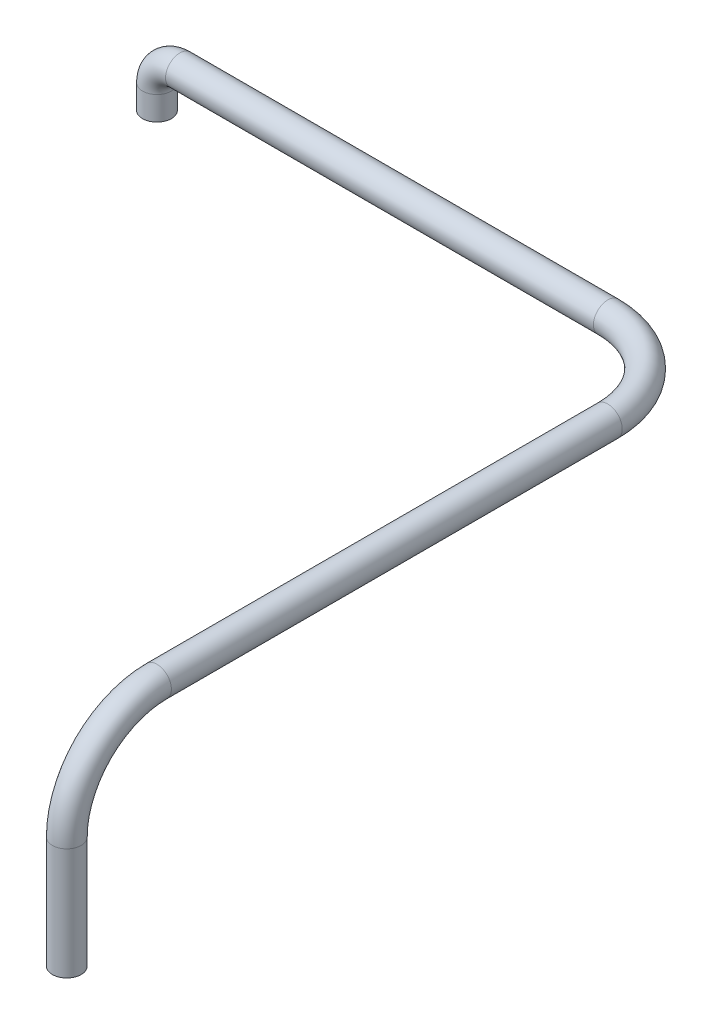
ISO-10303-21;
HEADER;
FILE_DESCRIPTION(('STEP AP214'),'2;1');
FILE_NAME('part.step','',(''),(''),'','','');
FILE_SCHEMA(('AUTOMOTIVE_DESIGN { 1 0 10303 214 1 1 1 1 }'));
ENDSEC;
DATA;
#1=APPLICATION_CONTEXT('core data for automotive mechanical design processes');
#2=APPLICATION_PROTOCOL_DEFINITION('international standard','automotive_design',2000,#1);
#3=PRODUCT_CONTEXT('',#1,'mechanical');
#4=PRODUCT('Part','Part','',(#3));
#5=PRODUCT_RELATED_PRODUCT_CATEGORY('part','',(#4));
#6=PRODUCT_DEFINITION_FORMATION('','',#4);
#7=PRODUCT_DEFINITION_CONTEXT('part definition',#1,'design');
#8=PRODUCT_DEFINITION('design','',#6,#7);
#9=PRODUCT_DEFINITION_SHAPE('','',#8);
#10=(LENGTH_UNIT() NAMED_UNIT(*) SI_UNIT(.MILLI.,.METRE.));
#11=(NAMED_UNIT(*) PLANE_ANGLE_UNIT() SI_UNIT($,.RADIAN.));
#12=(NAMED_UNIT(*) SI_UNIT($,.STERADIAN.) SOLID_ANGLE_UNIT());
#13=UNCERTAINTY_MEASURE_WITH_UNIT(LENGTH_MEASURE(1.E-05),#10,'distance_accuracy_value','');
#14=(GEOMETRIC_REPRESENTATION_CONTEXT(3) GLOBAL_UNCERTAINTY_ASSIGNED_CONTEXT((#13)) GLOBAL_UNIT_ASSIGNED_CONTEXT((#10,
#11,#12)) REPRESENTATION_CONTEXT('',''));
#15=CARTESIAN_POINT('',(0.,0.,0.));
#16=DIRECTION('',(0.,0.,1.));
#17=DIRECTION('',(1.,0.,0.));
#18=AXIS2_PLACEMENT_3D('',#15,#16,#17);
#19=CARTESIAN_POINT('',(-150.,43.,-175.));
#20=DIRECTION('',(0.,1.,0.));
#21=DIRECTION('',(0.,0.,1.));
#22=AXIS2_PLACEMENT_3D('',#19,#20,#21);
#23=PLANE('',#22);
#24=CARTESIAN_POINT('',(-150.,43.,-175.));
#25=DIRECTION('',(0.,1.,0.));
#26=DIRECTION('',(0.,0.,1.));
#27=AXIS2_PLACEMENT_3D('',#24,#25,#26);
#28=CIRCLE('',#27,3.);
#29=CARTESIAN_POINT('',(-150.,43.,-172.));
#30=VERTEX_POINT('',#29);
#31=EDGE_CURVE('E286',#30,#30,#28,.T.);
#32=ORIENTED_EDGE('',*,*,#31,.T.);
#33=EDGE_LOOP('',(#32));
#34=FACE_BOUND('',#33,.T.);
#35=CARTESIAN_POINT('',(-150.,43.,-175.));
#36=DIRECTION('',(0.,1.,0.));
#37=DIRECTION('',(0.,0.,1.));
#38=AXIS2_PLACEMENT_3D('',#35,#36,#37);
#39=CIRCLE('',#38,4.);
#40=CARTESIAN_POINT('',(-150.,43.,-171.));
#41=VERTEX_POINT('',#40);
#42=EDGE_CURVE('E70',#41,#41,#39,.T.);
#43=ORIENTED_EDGE('',*,*,#42,.F.);
#44=EDGE_LOOP('',(#43));
#45=FACE_BOUND('',#44,.T.);
#46=ADVANCED_FACE('F67',(#34,#45),#23,.F.);
#47=CARTESIAN_POINT('',(0.,0.,0.));
#48=DIRECTION('',(0.,-1.,0.));
#49=DIRECTION('',(-1.,0.,0.));
#50=AXIS2_PLACEMENT_3D('',#47,#48,#49);
#51=PLANE('',#50);
#52=CARTESIAN_POINT('',(0.,0.,0.));
#53=DIRECTION('',(0.,-1.,0.));
#54=DIRECTION('',(0.,0.,-1.));
#55=AXIS2_PLACEMENT_3D('',#52,#53,#54);
#56=CIRCLE('',#55,3.);
#57=CARTESIAN_POINT('',(0.,0.,3.00000000000006));
#58=VERTEX_POINT('',#57);
#59=EDGE_CURVE('E297',#58,#58,#56,.T.);
#60=ORIENTED_EDGE('',*,*,#59,.F.);
#61=EDGE_LOOP('',(#60));
#62=FACE_BOUND('',#61,.T.);
#63=CARTESIAN_POINT('',(0.,0.,0.));
#64=DIRECTION('',(0.,-1.,0.));
#65=DIRECTION('',(-1.,0.,0.));
#66=AXIS2_PLACEMENT_3D('',#63,#64,#65);
#67=CIRCLE('',#66,4.);
#68=CARTESIAN_POINT('',(0.,0.,4.00000000000006));
#69=VERTEX_POINT('',#68);
#70=EDGE_CURVE('E84',#69,#69,#67,.T.);
#71=ORIENTED_EDGE('',*,*,#70,.T.);
#72=EDGE_LOOP('',(#71));
#73=FACE_BOUND('',#72,.T.);
#74=ADVANCED_FACE('F108',(#62,#73),#51,.T.);
#75=CARTESIAN_POINT('',(-150.,49.63,-175.));
#76=DIRECTION('',(0.,-1.,0.));
#77=DIRECTION('',(0.,0.,-1.));
#78=AXIS2_PLACEMENT_3D('',#75,#76,#77);
#79=CYLINDRICAL_SURFACE('',#78,4.);
#80=ORIENTED_EDGE('',*,*,#42,.T.);
#81=EDGE_LOOP('',(#80));
#82=FACE_BOUND('',#81,.T.);
#83=CARTESIAN_POINT('',(-150.,49.63,-175.));
#84=DIRECTION('',(1.05137569081173E-07,0.999999999999994,0.));
#85=DIRECTION('',(0.,0.,1.));
#86=AXIS2_PLACEMENT_3D('',#83,#84,#85);
#87=CIRCLE('',#86,4.);
#88=CARTESIAN_POINT('',(-154.,49.6300004205503,-175.));
#89=VERTEX_POINT('',#88);
#90=EDGE_CURVE('E95',#89,#89,#87,.T.);
#91=ORIENTED_EDGE('',*,*,#90,.F.);
#92=EDGE_LOOP('',(#91));
#93=FACE_BOUND('',#92,.T.);
#94=ADVANCED_FACE('F106',(#82,#93),#79,.T.);
#95=CARTESIAN_POINT('',(-25.,56.,-175.));
#96=DIRECTION('',(-1.,0.,0.));
#97=DIRECTION('',(0.,0.,1.));
#98=AXIS2_PLACEMENT_3D('',#95,#96,#97);
#99=CYLINDRICAL_SURFACE('',#98,4.);
#100=CARTESIAN_POINT('',(-143.629999330274,56.,-175.));
#101=DIRECTION('',(1.,0.,0.));
#102=DIRECTION('',(0.,0.,1.));
#103=AXIS2_PLACEMENT_3D('',#100,#101,#102);
#104=CIRCLE('',#103,4.);
#105=CARTESIAN_POINT('',(-143.629999330274,60.0000000000001,-175.));
#106=VERTEX_POINT('',#105);
#107=EDGE_CURVE('E92',#106,#106,#104,.T.);
#108=ORIENTED_EDGE('',*,*,#107,.T.);
#109=EDGE_LOOP('',(#108));
#110=FACE_BOUND('',#109,.T.);
#111=CARTESIAN_POINT('',(-25.,56.,-175.));
#112=DIRECTION('',(0.999999999999998,0.,-6.42331466807782E-08));
#113=DIRECTION('',(6.42331466807782E-08,0.,0.999999999999998));
#114=AXIS2_PLACEMENT_3D('',#111,#112,#113);
#115=CIRCLE('',#114,4.);
#116=CARTESIAN_POINT('',(-25.0000002569326,56.,-179.));
#117=VERTEX_POINT('',#116);
#118=EDGE_CURVE('E93',#117,#117,#115,.T.);
#119=ORIENTED_EDGE('',*,*,#118,.F.);
#120=EDGE_LOOP('',(#119));
#121=FACE_BOUND('',#120,.T.);
#122=ADVANCED_FACE('F107',(#110,#121),#99,.T.);
#123=CARTESIAN_POINT('',(-143.629999330274,49.6299993302736,-175.));
#124=DIRECTION('',(0.,0.,1.));
#125=DIRECTION('',(1.,0.,0.));
#126=AXIS2_PLACEMENT_3D('',#123,#124,#125);
#127=TOROIDAL_SURFACE('',#126,6.37000066972643,4.);
#128=CARTESIAN_POINT('',(-143.629999330274,49.6299993302736,-175.));
#129=DIRECTION('',(0.,0.,1.));
#130=DIRECTION('',(1.,0.,0.));
#131=AXIS2_PLACEMENT_3D('',#128,#129,#130);
#132=CIRCLE('',#131,10.3700006697264);
#133=EDGE_CURVE('',#106,#89,#132,.T.);
#134=ORIENTED_EDGE('',*,*,#107,.F.);
#135=ORIENTED_EDGE('',*,*,#90,.T.);
#136=ORIENTED_EDGE('',*,*,#133,.T.);
#137=ORIENTED_EDGE('',*,*,#133,.F.);
#138=EDGE_LOOP('',(#134,#136,#135,#137));
#139=FACE_BOUND('',#138,.T.);
#140=ADVANCED_FACE('F103',(#139),#127,.T.);
#141=CARTESIAN_POINT('',(0.,56.,-25.));
#142=DIRECTION('',(0.,0.,-1.));
#143=DIRECTION('',(-1.,0.,0.));
#144=AXIS2_PLACEMENT_3D('',#141,#142,#143);
#145=CYLINDRICAL_SURFACE('',#144,4.);
#146=CARTESIAN_POINT('',(0.,56.,-150.000001605829));
#147=DIRECTION('',(0.,0.,1.));
#148=DIRECTION('',(-1.,0.,0.));
#149=AXIS2_PLACEMENT_3D('',#146,#147,#148);
#150=CIRCLE('',#149,4.);
#151=CARTESIAN_POINT('',(4.00000000000006,56.,-150.000001605829));
#152=VERTEX_POINT('',#151);
#153=EDGE_CURVE('E87',#152,#152,#150,.T.);
#154=ORIENTED_EDGE('',*,*,#153,.T.);
#155=EDGE_LOOP('',(#154));
#156=FACE_BOUND('',#155,.T.);
#157=CARTESIAN_POINT('',(0.,56.,-25.0000000000001));
#158=DIRECTION('',(0.,6.42331450154434E-08,0.999999999999998));
#159=DIRECTION('',(-1.,0.,0.));
#160=AXIS2_PLACEMENT_3D('',#157,#158,#159);
#161=CIRCLE('',#160,4.);
#162=CARTESIAN_POINT('',(0.,60.,-25.0000002569326));
#163=VERTEX_POINT('',#162);
#164=EDGE_CURVE('E11',#163,#163,#161,.T.);
#165=ORIENTED_EDGE('',*,*,#164,.F.);
#166=EDGE_LOOP('',(#165));
#167=FACE_BOUND('',#166,.T.);
#168=ADVANCED_FACE('F137',(#156,#167),#145,.T.);
#169=CARTESIAN_POINT('',(-24.9999983941714,56.,-150.000001605829));
#170=DIRECTION('',(0.,1.,0.));
#171=DIRECTION('',(0.,0.,1.));
#172=AXIS2_PLACEMENT_3D('',#169,#170,#171);
#173=TOROIDAL_SURFACE('',#172,24.9999983941715,4.);
#174=CARTESIAN_POINT('',(-24.9999983941714,56.,-150.000001605829));
#175=DIRECTION('',(0.,1.,0.));
#176=DIRECTION('',(0.,0.,1.));
#177=AXIS2_PLACEMENT_3D('',#174,#175,#176);
#178=CIRCLE('',#177,28.9999983941715);
#179=EDGE_CURVE('',#152,#117,#178,.T.);
#180=ORIENTED_EDGE('',*,*,#153,.F.);
#181=ORIENTED_EDGE('',*,*,#118,.T.);
#182=ORIENTED_EDGE('',*,*,#179,.T.);
#183=ORIENTED_EDGE('',*,*,#179,.F.);
#184=EDGE_LOOP('',(#180,#182,#181,#183));
#185=FACE_BOUND('',#184,.T.);
#186=ADVANCED_FACE('F135',(#185),#173,.T.);
#187=CARTESIAN_POINT('',(0.,0.,0.));
#188=DIRECTION('',(0.,1.,0.));
#189=DIRECTION('',(0.,0.,1.));
#190=AXIS2_PLACEMENT_3D('',#187,#188,#189);
#191=CYLINDRICAL_SURFACE('',#190,4.);
#192=CARTESIAN_POINT('',(0.,31.0000016058286,0.));
#193=DIRECTION('',(0.,-1.,0.));
#194=DIRECTION('',(-1.,0.,0.));
#195=AXIS2_PLACEMENT_3D('',#192,#193,#194);
#196=CIRCLE('',#195,4.);
#197=CARTESIAN_POINT('',(0.,31.0000016058286,4.00000000000006));
#198=VERTEX_POINT('',#197);
#199=EDGE_CURVE('E73',#198,#198,#196,.T.);
#200=CARTESIAN_POINT('',(0.,31.0000016058286,4.00000000000006));
#201=CARTESIAN_POINT('',(0.,30.6770849224345,4.00000000000006));
#202=CARTESIAN_POINT('',(0.,30.3541682390405,4.00000000000006));
#203=CARTESIAN_POINT('',(0.,29.7083348722524,4.00000000000006));
#204=CARTESIAN_POINT('',(0.,29.3854181888583,4.00000000000006));
#205=CARTESIAN_POINT('',(0.,28.7395848220702,4.00000000000006));
#206=CARTESIAN_POINT('',(0.,28.4166681386762,4.00000000000006));
#207=CARTESIAN_POINT('',(0.,27.7708347718881,4.00000000000006));
#208=CARTESIAN_POINT('',(0.,27.447918088494,4.00000000000006));
#209=CARTESIAN_POINT('',(0.,26.802084721706,4.00000000000006));
#210=CARTESIAN_POINT('',(0.,26.4791680383119,4.00000000000006));
#211=CARTESIAN_POINT('',(0.,25.8333346715238,4.00000000000006));
#212=CARTESIAN_POINT('',(0.,25.5104179881298,4.00000000000006));
#213=CARTESIAN_POINT('',(0.,24.8645846213417,4.00000000000006));
#214=CARTESIAN_POINT('',(0.,24.5416679379476,4.00000000000006));
#215=CARTESIAN_POINT('',(0.,23.8958345711595,4.00000000000006));
#216=CARTESIAN_POINT('',(0.,23.5729178877655,4.00000000000006));
#217=CARTESIAN_POINT('',(0.,22.9270845209774,4.00000000000006));
#218=CARTESIAN_POINT('',(0.,22.6041678375833,4.00000000000006));
#219=CARTESIAN_POINT('',(0.,21.9583344707952,4.00000000000006));
#220=CARTESIAN_POINT('',(0.,21.6354177874012,4.00000000000006));
#221=CARTESIAN_POINT('',(0.,20.9895844206131,4.00000000000006));
#222=CARTESIAN_POINT('',(0.,20.6666677372191,4.00000000000006));
#223=CARTESIAN_POINT('',(0.,20.020834370431,4.00000000000006));
#224=CARTESIAN_POINT('',(0.,19.6979176870369,4.00000000000006));
#225=CARTESIAN_POINT('',(0.,19.0520843202488,4.00000000000006));
#226=CARTESIAN_POINT('',(0.,18.7291676368548,4.00000000000006));
#227=CARTESIAN_POINT('',(0.,18.0833342700667,4.00000000000006));
#228=CARTESIAN_POINT('',(0.,17.7604175866726,4.00000000000006));
#229=CARTESIAN_POINT('',(0.,17.1145842198845,4.00000000000006));
#230=CARTESIAN_POINT('',(0.,16.7916675364905,4.00000000000006));
#231=CARTESIAN_POINT('',(0.,16.1458341697024,4.00000000000006));
#232=CARTESIAN_POINT('',(0.,15.8229174863084,4.00000000000006));
#233=CARTESIAN_POINT('',(0.,15.1770841195203,4.00000000000006));
#234=CARTESIAN_POINT('',(0.,14.8541674361262,4.00000000000006));
#235=CARTESIAN_POINT('',(0.,14.2083340693381,4.00000000000006));
#236=CARTESIAN_POINT('',(0.,13.8854173859441,4.00000000000006));
#237=CARTESIAN_POINT('',(0.,13.239584019156,4.00000000000006));
#238=CARTESIAN_POINT('',(0.,12.9166673357619,4.00000000000006));
#239=CARTESIAN_POINT('',(0.,12.2708339689738,4.00000000000006));
#240=CARTESIAN_POINT('',(0.,11.9479172855798,4.00000000000006));
#241=CARTESIAN_POINT('',(0.,11.3020839187917,4.00000000000006));
#242=CARTESIAN_POINT('',(0.,10.9791672353976,4.00000000000006));
#243=CARTESIAN_POINT('',(0.,10.3333338686096,4.00000000000006));
#244=CARTESIAN_POINT('',(0.,10.0104171852155,4.00000000000006));
#245=CARTESIAN_POINT('',(0.,9.36458381842741,4.00000000000006));
#246=CARTESIAN_POINT('',(0.,9.04166713503336,4.00000000000006));
#247=CARTESIAN_POINT('',(0.,8.39583376824527,4.00000000000006));
#248=CARTESIAN_POINT('',(0.,8.07291708485122,4.00000000000006));
#249=CARTESIAN_POINT('',(0.,7.42708371806313,4.00000000000006));
#250=CARTESIAN_POINT('',(0.,7.10416703466908,4.00000000000006));
#251=CARTESIAN_POINT('',(0.,6.45833366788099,4.00000000000006));
#252=CARTESIAN_POINT('',(0.,6.13541698448694,4.00000000000006));
#253=CARTESIAN_POINT('',(0.,5.48958361769885,4.00000000000006));
#254=CARTESIAN_POINT('',(0.,5.1666669343048,4.00000000000006));
#255=CARTESIAN_POINT('',(0.,4.52083356751671,4.00000000000006));
#256=CARTESIAN_POINT('',(0.,4.19791688412266,4.00000000000006));
#257=CARTESIAN_POINT('',(0.,3.55208351733456,4.00000000000006));
#258=CARTESIAN_POINT('',(0.,3.22916683394052,4.00000000000006));
#259=CARTESIAN_POINT('',(0.,2.58333346715242,4.00000000000006));
#260=CARTESIAN_POINT('',(0.,2.26041678375838,4.00000000000006));
#261=CARTESIAN_POINT('',(0.,1.61458341697028,4.00000000000006));
#262=CARTESIAN_POINT('',(0.,1.29166673357624,4.00000000000006));
#263=CARTESIAN_POINT('',(0.,0.645833366788142,4.00000000000006));
#264=CARTESIAN_POINT('',(0.,0.322916683394096,4.00000000000006));
#265=CARTESIAN_POINT('',(0.,0.,4.00000000000006));
#266=B_SPLINE_CURVE_WITH_KNOTS('',3,(#200,#201,#202,#203,#204,#205,#206,#207,#208,#209,#210,
#211,#212,#213,#214,#215,#216,#217,#218,#219,#220,#221,#222,#223,#224,#225,#226,#227,#228,#229,
#230,#231,#232,#233,#234,#235,#236,#237,#238,#239,#240,#241,#242,#243,#244,#245,#246,#247,#248,
#249,#250,#251,#252,#253,#254,#255,#256,#257,#258,#259,#260,#261,#262,#263,#264,#265),
.UNSPECIFIED.,.F.,.F.,(4,2,2,2,2,2,2,2,2,2,2,2,2,2,2,2,2,2,2,2,2,2,2,2,2,2,2,2,2,2,2,2,4),(0.,
0.968750050182141,1.93750010036428,2.90625015054642,3.87500020072856,4.8437502509107,
5.81250030109285,6.78125035127499,7.75000040145713,8.71875045163927,9.68750050182141,
10.6562505520036,11.6250006021857,12.5937506523678,13.56250070255,14.5312507527321,
15.5000008029143,16.4687508530964,17.4375009032785,18.4062509534607,19.3750010036428,
20.343751053825,21.3125011040071,22.2812511541892,23.2500012043714,24.2187512545535,
25.1875013047357,26.1562513549178,27.1250014051,28.0937514552821,29.0625015054642,
30.0312515556464,31.0000016058285),.UNSPECIFIED.);
#267=EDGE_CURVE('BSEAM124',#198,#69,#266,.T.);
#268=ORIENTED_EDGE('',*,*,#199,.T.);
#269=ORIENTED_EDGE('',*,*,#70,.F.);
#270=ORIENTED_EDGE('',*,*,#267,.T.);
#271=ORIENTED_EDGE('',*,*,#267,.F.);
#272=EDGE_LOOP('',(#268,#270,#269,#271));
#273=FACE_BOUND('',#272,.T.);
#274=ADVANCED_FACE('F124',(#273),#191,.T.);
#275=CARTESIAN_POINT('',(0.,31.0000016058285,-24.9999983941715));
#276=DIRECTION('',(-1.,0.,0.));
#277=DIRECTION('',(0.,0.,1.));
#278=AXIS2_PLACEMENT_3D('',#275,#276,#277);
#279=TOROIDAL_SURFACE('',#278,24.9999983941716,4.);
#280=CARTESIAN_POINT('',(0.,31.0000016058285,-24.9999983941715));
#281=DIRECTION('',(-1.,0.,0.));
#282=DIRECTION('',(0.,0.,1.));
#283=AXIS2_PLACEMENT_3D('',#280,#281,#282);
#284=CIRCLE('',#283,28.9999983941716);
#285=EDGE_CURVE('',#198,#163,#284,.T.);
#286=ORIENTED_EDGE('',*,*,#199,.F.);
#287=ORIENTED_EDGE('',*,*,#164,.T.);
#288=ORIENTED_EDGE('',*,*,#285,.T.);
#289=ORIENTED_EDGE('',*,*,#285,.F.);
#290=EDGE_LOOP('',(#286,#288,#287,#289));
#291=FACE_BOUND('',#290,.T.);
#292=ADVANCED_FACE('F118',(#291),#279,.T.);
#293=CARTESIAN_POINT('',(0.,-4.00000000000005,0.));
#294=DIRECTION('',(0.,1.,0.));
#295=DIRECTION('',(0.,0.,1.));
#296=AXIS2_PLACEMENT_3D('',#293,#294,#295);
#297=CYLINDRICAL_SURFACE('',#296,3.);
#298=CARTESIAN_POINT('',(0.,31.0000016058286,0.));
#299=DIRECTION('',(0.,-1.,0.));
#300=DIRECTION('',(-1.,0.,0.));
#301=AXIS2_PLACEMENT_3D('',#298,#299,#300);
#302=CIRCLE('',#301,3.);
#303=CARTESIAN_POINT('',(0.,31.0000016058286,3.00000000000006));
#304=VERTEX_POINT('',#303);
#305=EDGE_CURVE('E281',#304,#304,#302,.T.);
#306=CARTESIAN_POINT('',(0.,31.0000016058286,3.00000000000006));
#307=CARTESIAN_POINT('',(0.,30.6770849224345,3.00000000000006));
#308=CARTESIAN_POINT('',(0.,30.3541682390405,3.00000000000006));
#309=CARTESIAN_POINT('',(0.,29.7083348722524,3.00000000000006));
#310=CARTESIAN_POINT('',(0.,29.3854181888583,3.00000000000006));
#311=CARTESIAN_POINT('',(0.,28.7395848220702,3.00000000000006));
#312=CARTESIAN_POINT('',(0.,28.4166681386762,3.00000000000006));
#313=CARTESIAN_POINT('',(0.,27.7708347718881,3.00000000000006));
#314=CARTESIAN_POINT('',(0.,27.447918088494,3.00000000000006));
#315=CARTESIAN_POINT('',(0.,26.802084721706,3.00000000000006));
#316=CARTESIAN_POINT('',(0.,26.4791680383119,3.00000000000006));
#317=CARTESIAN_POINT('',(0.,25.8333346715238,3.00000000000006));
#318=CARTESIAN_POINT('',(0.,25.5104179881298,3.00000000000006));
#319=CARTESIAN_POINT('',(0.,24.8645846213417,3.00000000000006));
#320=CARTESIAN_POINT('',(0.,24.5416679379476,3.00000000000006));
#321=CARTESIAN_POINT('',(0.,23.8958345711595,3.00000000000006));
#322=CARTESIAN_POINT('',(0.,23.5729178877655,3.00000000000006));
#323=CARTESIAN_POINT('',(0.,22.9270845209774,3.00000000000006));
#324=CARTESIAN_POINT('',(0.,22.6041678375833,3.00000000000006));
#325=CARTESIAN_POINT('',(0.,21.9583344707952,3.00000000000006));
#326=CARTESIAN_POINT('',(0.,21.6354177874012,3.00000000000006));
#327=CARTESIAN_POINT('',(0.,20.9895844206131,3.00000000000006));
#328=CARTESIAN_POINT('',(0.,20.6666677372191,3.00000000000006));
#329=CARTESIAN_POINT('',(0.,20.020834370431,3.00000000000006));
#330=CARTESIAN_POINT('',(0.,19.6979176870369,3.00000000000006));
#331=CARTESIAN_POINT('',(0.,19.0520843202488,3.00000000000006));
#332=CARTESIAN_POINT('',(0.,18.7291676368548,3.00000000000006));
#333=CARTESIAN_POINT('',(0.,18.0833342700667,3.00000000000006));
#334=CARTESIAN_POINT('',(0.,17.7604175866726,3.00000000000006));
#335=CARTESIAN_POINT('',(0.,17.1145842198845,3.00000000000006));
#336=CARTESIAN_POINT('',(0.,16.7916675364905,3.00000000000006));
#337=CARTESIAN_POINT('',(0.,16.1458341697024,3.00000000000006));
#338=CARTESIAN_POINT('',(0.,15.8229174863084,3.00000000000006));
#339=CARTESIAN_POINT('',(0.,15.1770841195203,3.00000000000006));
#340=CARTESIAN_POINT('',(0.,14.8541674361262,3.00000000000006));
#341=CARTESIAN_POINT('',(0.,14.2083340693381,3.00000000000006));
#342=CARTESIAN_POINT('',(0.,13.8854173859441,3.00000000000006));
#343=CARTESIAN_POINT('',(0.,13.239584019156,3.00000000000006));
#344=CARTESIAN_POINT('',(0.,12.9166673357619,3.00000000000006));
#345=CARTESIAN_POINT('',(0.,12.2708339689738,3.00000000000006));
#346=CARTESIAN_POINT('',(0.,11.9479172855798,3.00000000000006));
#347=CARTESIAN_POINT('',(0.,11.3020839187917,3.00000000000006));
#348=CARTESIAN_POINT('',(0.,10.9791672353976,3.00000000000006));
#349=CARTESIAN_POINT('',(0.,10.3333338686096,3.00000000000006));
#350=CARTESIAN_POINT('',(0.,10.0104171852155,3.00000000000006));
#351=CARTESIAN_POINT('',(0.,9.36458381842741,3.00000000000006));
#352=CARTESIAN_POINT('',(0.,9.04166713503336,3.00000000000006));
#353=CARTESIAN_POINT('',(0.,8.39583376824527,3.00000000000006));
#354=CARTESIAN_POINT('',(0.,8.07291708485122,3.00000000000006));
#355=CARTESIAN_POINT('',(0.,7.42708371806313,3.00000000000006));
#356=CARTESIAN_POINT('',(0.,7.10416703466908,3.00000000000006));
#357=CARTESIAN_POINT('',(0.,6.45833366788099,3.00000000000006));
#358=CARTESIAN_POINT('',(0.,6.13541698448694,3.00000000000006));
#359=CARTESIAN_POINT('',(0.,5.48958361769885,3.00000000000006));
#360=CARTESIAN_POINT('',(0.,5.1666669343048,3.00000000000006));
#361=CARTESIAN_POINT('',(0.,4.52083356751671,3.00000000000006));
#362=CARTESIAN_POINT('',(0.,4.19791688412266,3.00000000000006));
#363=CARTESIAN_POINT('',(0.,3.55208351733456,3.00000000000006));
#364=CARTESIAN_POINT('',(0.,3.22916683394052,3.00000000000006));
#365=CARTESIAN_POINT('',(0.,2.58333346715242,3.00000000000006));
#366=CARTESIAN_POINT('',(0.,2.26041678375838,3.00000000000006));
#367=CARTESIAN_POINT('',(0.,1.61458341697028,3.00000000000006));
#368=CARTESIAN_POINT('',(0.,1.29166673357624,3.00000000000006));
#369=CARTESIAN_POINT('',(0.,0.645833366788142,3.00000000000006));
#370=CARTESIAN_POINT('',(0.,0.322916683394096,3.00000000000006));
#371=CARTESIAN_POINT('',(0.,0.,3.00000000000006));
#372=B_SPLINE_CURVE_WITH_KNOTS('',3,(#306,#307,#308,#309,#310,#311,#312,#313,#314,#315,#316,
#317,#318,#319,#320,#321,#322,#323,#324,#325,#326,#327,#328,#329,#330,#331,#332,#333,#334,#335,
#336,#337,#338,#339,#340,#341,#342,#343,#344,#345,#346,#347,#348,#349,#350,#351,#352,#353,#354,
#355,#356,#357,#358,#359,#360,#361,#362,#363,#364,#365,#366,#367,#368,#369,#370,#371),
.UNSPECIFIED.,.F.,.F.,(4,2,2,2,2,2,2,2,2,2,2,2,2,2,2,2,2,2,2,2,2,2,2,2,2,2,2,2,2,2,2,2,4),(0.,
0.968750050182141,1.93750010036428,2.90625015054642,3.87500020072856,4.8437502509107,
5.81250030109285,6.78125035127499,7.75000040145713,8.71875045163927,9.68750050182141,
10.6562505520036,11.6250006021857,12.5937506523678,13.56250070255,14.5312507527321,
15.5000008029143,16.4687508530964,17.4375009032785,18.4062509534607,19.3750010036428,
20.343751053825,21.3125011040071,22.2812511541892,23.2500012043714,24.2187512545535,
25.1875013047357,26.1562513549178,27.1250014051,28.0937514552821,29.0625015054642,
30.0312515556464,31.0000016058285),.UNSPECIFIED.);
#373=EDGE_CURVE('BSEAM122',#304,#58,#372,.T.);
#374=ORIENTED_EDGE('',*,*,#305,.F.);
#375=ORIENTED_EDGE('',*,*,#59,.T.);
#376=ORIENTED_EDGE('',*,*,#373,.T.);
#377=ORIENTED_EDGE('',*,*,#373,.F.);
#378=EDGE_LOOP('',(#374,#376,#375,#377));
#379=FACE_BOUND('',#378,.T.);
#380=ADVANCED_FACE('F122',(#379),#297,.F.);
#381=CARTESIAN_POINT('',(-150.,49.63,-175.));
#382=DIRECTION('',(0.,-1.,0.));
#383=DIRECTION('',(0.,0.,-1.));
#384=AXIS2_PLACEMENT_3D('',#381,#382,#383);
#385=CYLINDRICAL_SURFACE('',#384,3.);
#386=ORIENTED_EDGE('',*,*,#31,.F.);
#387=EDGE_LOOP('',(#386));
#388=FACE_BOUND('',#387,.T.);
#389=CARTESIAN_POINT('',(-150.,49.63,-175.));
#390=DIRECTION('',(1.05137569081173E-07,0.999999999999994,0.));
#391=DIRECTION('',(0.,0.,1.));
#392=AXIS2_PLACEMENT_3D('',#389,#390,#391);
#393=CIRCLE('',#392,3.);
#394=CARTESIAN_POINT('',(-153.,49.6300003154127,-175.));
#395=VERTEX_POINT('',#394);
#396=EDGE_CURVE('E302',#395,#395,#393,.T.);
#397=ORIENTED_EDGE('',*,*,#396,.T.);
#398=EDGE_LOOP('',(#397));
#399=FACE_BOUND('',#398,.T.);
#400=ADVANCED_FACE('F126',(#388,#399),#385,.F.);
#401=CARTESIAN_POINT('',(-25.,56.,-175.));
#402=DIRECTION('',(-1.,0.,0.));
#403=DIRECTION('',(0.,0.,1.));
#404=AXIS2_PLACEMENT_3D('',#401,#402,#403);
#405=CYLINDRICAL_SURFACE('',#404,3.);
#406=CARTESIAN_POINT('',(-143.629999330274,56.,-175.));
#407=DIRECTION('',(1.,0.,0.));
#408=DIRECTION('',(0.,0.,1.));
#409=AXIS2_PLACEMENT_3D('',#406,#407,#408);
#410=CIRCLE('',#409,3.);
#411=CARTESIAN_POINT('',(-143.629999330274,59.,-175.));
#412=VERTEX_POINT('',#411);
#413=EDGE_CURVE('E292',#412,#412,#410,.T.);
#414=ORIENTED_EDGE('',*,*,#413,.F.);
#415=EDGE_LOOP('',(#414));
#416=FACE_BOUND('',#415,.T.);
#417=CARTESIAN_POINT('',(-25.,56.,-175.));
#418=DIRECTION('',(0.999999999999998,0.,-6.42331466807782E-08));
#419=DIRECTION('',(6.42331466807782E-08,0.,0.999999999999998));
#420=AXIS2_PLACEMENT_3D('',#417,#418,#419);
#421=CIRCLE('',#420,3.);
#422=CARTESIAN_POINT('',(-25.0000001926995,56.,-178.));
#423=VERTEX_POINT('',#422);
#424=EDGE_CURVE('E300',#423,#423,#421,.T.);
#425=ORIENTED_EDGE('',*,*,#424,.T.);
#426=EDGE_LOOP('',(#425));
#427=FACE_BOUND('',#426,.T.);
#428=ADVANCED_FACE('F191',(#416,#427),#405,.F.);
#429=CARTESIAN_POINT('',(-143.629999330274,49.6299993302736,-175.));
#430=DIRECTION('',(0.,0.,1.));
#431=DIRECTION('',(1.,0.,0.));
#432=AXIS2_PLACEMENT_3D('',#429,#430,#431);
#433=TOROIDAL_SURFACE('',#432,6.37000066972643,3.);
#434=CARTESIAN_POINT('',(-143.629999330274,49.6299993302736,-175.));
#435=DIRECTION('',(0.,0.,1.));
#436=DIRECTION('',(1.,0.,0.));
#437=AXIS2_PLACEMENT_3D('',#434,#435,#436);
#438=CIRCLE('',#437,9.37000066972644);
#439=EDGE_CURVE('',#412,#395,#438,.T.);
#440=ORIENTED_EDGE('',*,*,#413,.T.);
#441=ORIENTED_EDGE('',*,*,#396,.F.);
#442=ORIENTED_EDGE('',*,*,#439,.T.);
#443=ORIENTED_EDGE('',*,*,#439,.F.);
#444=EDGE_LOOP('',(#440,#442,#441,#443));
#445=FACE_BOUND('',#444,.T.);
#446=ADVANCED_FACE('F203',(#445),#433,.F.);
#447=CARTESIAN_POINT('',(0.,56.,-25.));
#448=DIRECTION('',(0.,0.,-1.));
#449=DIRECTION('',(-1.,0.,0.));
#450=AXIS2_PLACEMENT_3D('',#447,#448,#449);
#451=CYLINDRICAL_SURFACE('',#450,3.);
#452=CARTESIAN_POINT('',(0.,56.,-150.000001605829));
#453=DIRECTION('',(0.,0.,1.));
#454=DIRECTION('',(-1.,0.,0.));
#455=AXIS2_PLACEMENT_3D('',#452,#453,#454);
#456=CIRCLE('',#455,3.);
#457=CARTESIAN_POINT('',(3.00000000000006,56.,-150.000001605829));
#458=VERTEX_POINT('',#457);
#459=EDGE_CURVE('E299',#458,#458,#456,.T.);
#460=ORIENTED_EDGE('',*,*,#459,.F.);
#461=EDGE_LOOP('',(#460));
#462=FACE_BOUND('',#461,.T.);
#463=CARTESIAN_POINT('',(0.,56.,-25.0000000000001));
#464=DIRECTION('',(0.,6.42331450154434E-08,0.999999999999998));
#465=DIRECTION('',(-1.,0.,0.));
#466=AXIS2_PLACEMENT_3D('',#463,#464,#465);
#467=CIRCLE('',#466,3.);
#468=CARTESIAN_POINT('',(0.,59.,-25.0000001926995));
#469=VERTEX_POINT('',#468);
#470=EDGE_CURVE('E282',#469,#469,#467,.T.);
#471=ORIENTED_EDGE('',*,*,#470,.T.);
#472=EDGE_LOOP('',(#471));
#473=FACE_BOUND('',#472,.T.);
#474=ADVANCED_FACE('F211',(#462,#473),#451,.F.);
#475=CARTESIAN_POINT('',(-24.9999983941714,56.,-150.000001605829));
#476=DIRECTION('',(0.,1.,0.));
#477=DIRECTION('',(0.,0.,1.));
#478=AXIS2_PLACEMENT_3D('',#475,#476,#477);
#479=TOROIDAL_SURFACE('',#478,24.9999983941715,3.);
#480=CARTESIAN_POINT('',(-24.9999983941714,56.,-150.000001605829));
#481=DIRECTION('',(0.,1.,0.));
#482=DIRECTION('',(0.,0.,1.));
#483=AXIS2_PLACEMENT_3D('',#480,#481,#482);
#484=CIRCLE('',#483,27.9999983941715);
#485=EDGE_CURVE('',#458,#423,#484,.T.);
#486=ORIENTED_EDGE('',*,*,#459,.T.);
#487=ORIENTED_EDGE('',*,*,#424,.F.);
#488=ORIENTED_EDGE('',*,*,#485,.T.);
#489=ORIENTED_EDGE('',*,*,#485,.F.);
#490=EDGE_LOOP('',(#486,#488,#487,#489));
#491=FACE_BOUND('',#490,.T.);
#492=ADVANCED_FACE('F222',(#491),#479,.F.);
#493=CARTESIAN_POINT('',(0.,31.0000016058285,-24.9999983941715));
#494=DIRECTION('',(-1.,0.,0.));
#495=DIRECTION('',(0.,0.,1.));
#496=AXIS2_PLACEMENT_3D('',#493,#494,#495);
#497=TOROIDAL_SURFACE('',#496,24.9999983941716,3.);
#498=CARTESIAN_POINT('',(0.,31.0000016058285,-24.9999983941715));
#499=DIRECTION('',(-1.,0.,0.));
#500=DIRECTION('',(0.,0.,1.));
#501=AXIS2_PLACEMENT_3D('',#498,#499,#500);
#502=CIRCLE('',#501,27.9999983941716);
#503=EDGE_CURVE('',#304,#469,#502,.T.);
#504=ORIENTED_EDGE('',*,*,#305,.T.);
#505=ORIENTED_EDGE('',*,*,#470,.F.);
#506=ORIENTED_EDGE('',*,*,#503,.T.);
#507=ORIENTED_EDGE('',*,*,#503,.F.);
#508=EDGE_LOOP('',(#504,#506,#505,#507));
#509=FACE_BOUND('',#508,.T.);
#510=ADVANCED_FACE('F132',(#509),#497,.F.);
#511=CLOSED_SHELL('',(#46,#74,#94,#122,#140,#168,#186,#274,#292,#380,#400,#428,#446,#474,#492,#510));
#512=MANIFOLD_SOLID_BREP('B2',#511);
#513=ADVANCED_BREP_SHAPE_REPRESENTATION('',(#18,#512),#14);
#514=SHAPE_DEFINITION_REPRESENTATION(#9,#513);
ENDSEC;
END-ISO-10303-21;
